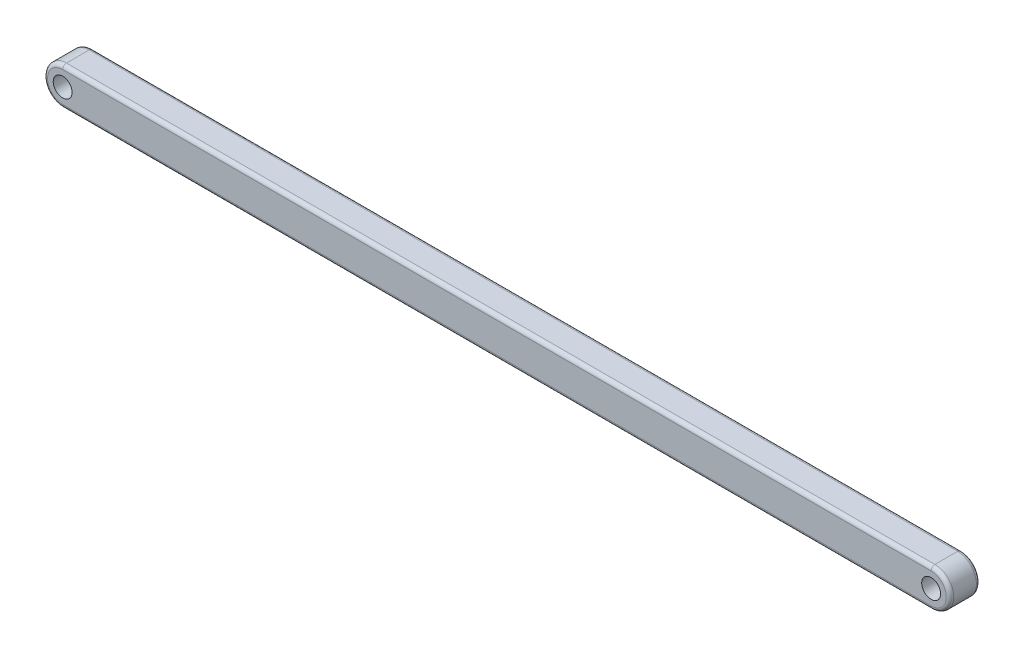
ISO-10303-21;
HEADER;
FILE_DESCRIPTION(('STEP AP214'),'2;1');
FILE_NAME('part.step','',(''),(''),'','','');
FILE_SCHEMA(('AUTOMOTIVE_DESIGN { 1 0 10303 214 1 1 1 1 }'));
ENDSEC;
DATA;
#1=APPLICATION_CONTEXT('core data for automotive mechanical design processes');
#2=APPLICATION_PROTOCOL_DEFINITION('international standard','automotive_design',2000,#1);
#3=PRODUCT_CONTEXT('',#1,'mechanical');
#4=PRODUCT('Part','Part','',(#3));
#5=PRODUCT_RELATED_PRODUCT_CATEGORY('part','',(#4));
#6=PRODUCT_DEFINITION_FORMATION('','',#4);
#7=PRODUCT_DEFINITION_CONTEXT('part definition',#1,'design');
#8=PRODUCT_DEFINITION('design','',#6,#7);
#9=PRODUCT_DEFINITION_SHAPE('','',#8);
#10=(LENGTH_UNIT() NAMED_UNIT(*) SI_UNIT(.MILLI.,.METRE.));
#11=(NAMED_UNIT(*) PLANE_ANGLE_UNIT() SI_UNIT($,.RADIAN.));
#12=(NAMED_UNIT(*) SI_UNIT($,.STERADIAN.) SOLID_ANGLE_UNIT());
#13=UNCERTAINTY_MEASURE_WITH_UNIT(LENGTH_MEASURE(1.E-05),#10,'distance_accuracy_value','');
#14=(GEOMETRIC_REPRESENTATION_CONTEXT(3) GLOBAL_UNCERTAINTY_ASSIGNED_CONTEXT((#13)) GLOBAL_UNIT_ASSIGNED_CONTEXT((#10,
#11,#12)) REPRESENTATION_CONTEXT('',''));
#15=CARTESIAN_POINT('',(0.,0.,0.));
#16=DIRECTION('',(0.,0.,1.));
#17=DIRECTION('',(1.,0.,0.));
#18=AXIS2_PLACEMENT_3D('',#15,#16,#17);
#19=CARTESIAN_POINT('',(-103.706896551724,0.,6.));
#20=DIRECTION('',(0.,0.,1.));
#21=DIRECTION('',(1.,0.,0.));
#22=AXIS2_PLACEMENT_3D('',#19,#20,#21);
#23=PLANE('',#22);
#24=DIRECTION('',(1.,0.,0.));
#25=VECTOR('',#24,1.);
#26=CARTESIAN_POINT('',(126.293103448276,-4.,6.));
#27=LINE('',#26,#25);
#28=CARTESIAN_POINT('',(-103.706896551724,-4.,6.));
#29=VERTEX_POINT('',#28);
#30=CARTESIAN_POINT('',(126.293103448276,-4.,6.));
#31=VERTEX_POINT('',#30);
#32=EDGE_CURVE('E54',#29,#31,#27,.T.);
#33=ORIENTED_EDGE('',*,*,#32,.T.);
#34=CARTESIAN_POINT('',(126.293103448276,0.,6.));
#35=DIRECTION('',(0.,0.,1.));
#36=DIRECTION('',(1.,0.,0.));
#37=AXIS2_PLACEMENT_3D('',#34,#35,#36);
#38=CIRCLE('',#37,4.);
#39=CARTESIAN_POINT('',(126.293103448276,4.,6.));
#40=VERTEX_POINT('',#39);
#41=EDGE_CURVE('E113',#31,#40,#38,.T.);
#42=ORIENTED_EDGE('',*,*,#41,.T.);
#43=DIRECTION('',(-1.,0.,0.));
#44=VECTOR('',#43,1.);
#45=CARTESIAN_POINT('',(-103.706896551724,4.,6.));
#46=LINE('',#45,#44);
#47=CARTESIAN_POINT('',(-103.706896551724,4.,6.));
#48=VERTEX_POINT('',#47);
#49=EDGE_CURVE('E137',#40,#48,#46,.T.);
#50=ORIENTED_EDGE('',*,*,#49,.T.);
#51=CARTESIAN_POINT('',(-103.706896551724,0.,6.));
#52=DIRECTION('',(0.,0.,1.));
#53=DIRECTION('',(1.,0.,0.));
#54=AXIS2_PLACEMENT_3D('',#51,#52,#53);
#55=CIRCLE('',#54,4.);
#56=EDGE_CURVE('E59',#48,#29,#55,.T.);
#57=ORIENTED_EDGE('',*,*,#56,.T.);
#58=EDGE_LOOP('',(#33,#42,#50,#57));
#59=FACE_BOUND('',#58,.T.);
#60=CARTESIAN_POINT('',(-103.706896551724,0.,6.));
#61=DIRECTION('',(0.,0.,1.));
#62=DIRECTION('',(1.,0.,0.));
#63=AXIS2_PLACEMENT_3D('',#60,#61,#62);
#64=CIRCLE('',#63,2.50000000000001);
#65=CARTESIAN_POINT('',(-101.206896551724,0.,6.));
#66=VERTEX_POINT('',#65);
#67=EDGE_CURVE('E174',#66,#66,#64,.T.);
#68=ORIENTED_EDGE('',*,*,#67,.F.);
#69=EDGE_LOOP('',(#68));
#70=FACE_BOUND('',#69,.T.);
#71=CARTESIAN_POINT('',(126.293103448276,0.,6.));
#72=DIRECTION('',(0.,0.,1.));
#73=DIRECTION('',(1.,0.,0.));
#74=AXIS2_PLACEMENT_3D('',#71,#72,#73);
#75=CIRCLE('',#74,2.5);
#76=CARTESIAN_POINT('',(128.793103448276,0.,6.));
#77=VERTEX_POINT('',#76);
#78=EDGE_CURVE('E166',#77,#77,#75,.T.);
#79=ORIENTED_EDGE('',*,*,#78,.F.);
#80=EDGE_LOOP('',(#79));
#81=FACE_BOUND('',#80,.T.);
#82=ADVANCED_FACE('F37',(#59,#70,#81),#23,.T.);
#83=CARTESIAN_POINT('',(-103.706896551724,0.,-2.));
#84=DIRECTION('',(0.,0.,1.));
#85=DIRECTION('',(1.,0.,0.));
#86=AXIS2_PLACEMENT_3D('',#83,#84,#85);
#87=PLANE('',#86);
#88=DIRECTION('',(-1.,0.,0.));
#89=VECTOR('',#88,1.);
#90=CARTESIAN_POINT('',(-103.706896551724,4.,-2.));
#91=LINE('',#90,#89);
#92=CARTESIAN_POINT('',(-103.706896551724,4.,-2.));
#93=VERTEX_POINT('',#92);
#94=CARTESIAN_POINT('',(126.293103448276,4.,-2.));
#95=VERTEX_POINT('',#94);
#96=EDGE_CURVE('E184',#93,#95,#91,.F.);
#97=ORIENTED_EDGE('',*,*,#96,.T.);
#98=CARTESIAN_POINT('',(126.293103448276,0.,-2.));
#99=DIRECTION('',(0.,0.,1.));
#100=DIRECTION('',(1.,0.,0.));
#101=AXIS2_PLACEMENT_3D('',#98,#99,#100);
#102=CIRCLE('',#101,4.);
#103=CARTESIAN_POINT('',(126.293103448276,-4.,-2.));
#104=VERTEX_POINT('',#103);
#105=EDGE_CURVE('E190',#95,#104,#102,.F.);
#106=ORIENTED_EDGE('',*,*,#105,.T.);
#107=DIRECTION('',(1.,0.,0.));
#108=VECTOR('',#107,1.);
#109=CARTESIAN_POINT('',(-103.706896551724,-4.,-2.));
#110=LINE('',#109,#108);
#111=CARTESIAN_POINT('',(-103.706896551724,-4.,-2.));
#112=VERTEX_POINT('',#111);
#113=EDGE_CURVE('E188',#104,#112,#110,.F.);
#114=ORIENTED_EDGE('',*,*,#113,.T.);
#115=CARTESIAN_POINT('',(-103.706896551724,0.,-2.));
#116=DIRECTION('',(0.,0.,1.));
#117=DIRECTION('',(1.,0.,0.));
#118=AXIS2_PLACEMENT_3D('',#115,#116,#117);
#119=CIRCLE('',#118,4.);
#120=EDGE_CURVE('E186',#112,#93,#119,.F.);
#121=ORIENTED_EDGE('',*,*,#120,.T.);
#122=EDGE_LOOP('',(#97,#106,#114,#121));
#123=FACE_BOUND('',#122,.T.);
#124=CARTESIAN_POINT('',(-103.706896551724,0.,-2.));
#125=DIRECTION('',(0.,0.,1.));
#126=DIRECTION('',(1.,0.,0.));
#127=AXIS2_PLACEMENT_3D('',#124,#125,#126);
#128=CIRCLE('',#127,2.50000000000001);
#129=CARTESIAN_POINT('',(-101.206896551724,0.,-2.));
#130=VERTEX_POINT('',#129);
#131=EDGE_CURVE('E171',#130,#130,#128,.T.);
#132=ORIENTED_EDGE('',*,*,#131,.T.);
#133=EDGE_LOOP('',(#132));
#134=FACE_BOUND('',#133,.T.);
#135=CARTESIAN_POINT('',(126.293103448276,0.,-2.));
#136=DIRECTION('',(0.,0.,1.));
#137=DIRECTION('',(1.,0.,0.));
#138=AXIS2_PLACEMENT_3D('',#135,#136,#137);
#139=CIRCLE('',#138,2.5);
#140=CARTESIAN_POINT('',(128.793103448276,0.,-2.));
#141=VERTEX_POINT('',#140);
#142=EDGE_CURVE('E160',#141,#141,#139,.T.);
#143=ORIENTED_EDGE('',*,*,#142,.T.);
#144=EDGE_LOOP('',(#143));
#145=FACE_BOUND('',#144,.T.);
#146=ADVANCED_FACE('F230',(#123,#134,#145),#87,.F.);
#147=CARTESIAN_POINT('',(-103.706896551724,0.,6.));
#148=DIRECTION('',(0.,0.,-1.));
#149=DIRECTION('',(-1.,0.,0.));
#150=AXIS2_PLACEMENT_3D('',#147,#148,#149);
#151=CYLINDRICAL_SURFACE('',#150,5.);
#152=DIRECTION('',(0.,0.,-1.));
#153=VECTOR('',#152,1.);
#154=CARTESIAN_POINT('',(-103.706896551724,5.,6.));
#155=LINE('',#154,#153);
#156=CARTESIAN_POINT('',(-103.706896551724,5.,5.));
#157=VERTEX_POINT('',#156);
#158=CARTESIAN_POINT('',(-103.706896551724,5.,-1.));
#159=VERTEX_POINT('',#158);
#160=EDGE_CURVE('E108',#157,#159,#155,.T.);
#161=ORIENTED_EDGE('',*,*,#160,.T.);
#162=CARTESIAN_POINT('',(-103.706896551724,0.,-1.));
#163=DIRECTION('',(0.,0.,1.));
#164=DIRECTION('',(1.,0.,0.));
#165=AXIS2_PLACEMENT_3D('',#162,#163,#164);
#166=CIRCLE('',#165,5.);
#167=CARTESIAN_POINT('',(-103.706896551724,-5.,-1.));
#168=VERTEX_POINT('',#167);
#169=EDGE_CURVE('E199',#159,#168,#166,.T.);
#170=ORIENTED_EDGE('',*,*,#169,.T.);
#171=DIRECTION('',(0.,0.,-1.));
#172=VECTOR('',#171,1.);
#173=CARTESIAN_POINT('',(-103.706896551724,-5.,6.));
#174=LINE('',#173,#172);
#175=CARTESIAN_POINT('',(-103.706896551724,-5.,5.));
#176=VERTEX_POINT('',#175);
#177=EDGE_CURVE('E134',#176,#168,#174,.T.);
#178=ORIENTED_EDGE('',*,*,#177,.F.);
#179=CARTESIAN_POINT('',(-103.706896551724,0.,5.));
#180=DIRECTION('',(0.,0.,1.));
#181=DIRECTION('',(1.,0.,0.));
#182=AXIS2_PLACEMENT_3D('',#179,#180,#181);
#183=CIRCLE('',#182,5.);
#184=EDGE_CURVE('E197',#176,#157,#183,.F.);
#185=ORIENTED_EDGE('',*,*,#184,.T.);
#186=EDGE_LOOP('',(#161,#170,#178,#185));
#187=FACE_BOUND('',#186,.T.);
#188=ADVANCED_FACE('F212',(#187),#151,.T.);
#189=CARTESIAN_POINT('',(-103.706896551724,-5.,6.));
#190=DIRECTION('',(0.,1.,0.));
#191=DIRECTION('',(0.,0.,1.));
#192=AXIS2_PLACEMENT_3D('',#189,#190,#191);
#193=PLANE('',#192);
#194=ORIENTED_EDGE('',*,*,#177,.T.);
#195=DIRECTION('',(1.,0.,0.));
#196=VECTOR('',#195,1.);
#197=CARTESIAN_POINT('',(-103.706896551724,-5.,-1.));
#198=LINE('',#197,#196);
#199=CARTESIAN_POINT('',(126.293103448276,-5.,-1.));
#200=VERTEX_POINT('',#199);
#201=EDGE_CURVE('E195',#168,#200,#198,.T.);
#202=ORIENTED_EDGE('',*,*,#201,.T.);
#203=DIRECTION('',(0.,0.,-1.));
#204=VECTOR('',#203,1.);
#205=CARTESIAN_POINT('',(126.293103448276,-5.,6.));
#206=LINE('',#205,#204);
#207=CARTESIAN_POINT('',(126.293103448276,-5.,5.));
#208=VERTEX_POINT('',#207);
#209=EDGE_CURVE('E125',#208,#200,#206,.T.);
#210=ORIENTED_EDGE('',*,*,#209,.F.);
#211=DIRECTION('',(1.,0.,0.));
#212=VECTOR('',#211,1.);
#213=CARTESIAN_POINT('',(-103.706896551724,-5.,5.));
#214=LINE('',#213,#212);
#215=EDGE_CURVE('E193',#208,#176,#214,.F.);
#216=ORIENTED_EDGE('',*,*,#215,.T.);
#217=EDGE_LOOP('',(#194,#202,#210,#216));
#218=FACE_BOUND('',#217,.T.);
#219=ADVANCED_FACE('F210',(#218),#193,.F.);
#220=CARTESIAN_POINT('',(126.293103448276,0.,6.));
#221=DIRECTION('',(0.,0.,-1.));
#222=DIRECTION('',(-1.,0.,0.));
#223=AXIS2_PLACEMENT_3D('',#220,#221,#222);
#224=CYLINDRICAL_SURFACE('',#223,5.);
#225=ORIENTED_EDGE('',*,*,#209,.T.);
#226=CARTESIAN_POINT('',(126.293103448276,0.,-1.));
#227=DIRECTION('',(0.,0.,1.));
#228=DIRECTION('',(1.,0.,0.));
#229=AXIS2_PLACEMENT_3D('',#226,#227,#228);
#230=CIRCLE('',#229,5.);
#231=CARTESIAN_POINT('',(126.293103448276,5.,-1.));
#232=VERTEX_POINT('',#231);
#233=EDGE_CURVE('E124',#200,#232,#230,.T.);
#234=ORIENTED_EDGE('',*,*,#233,.T.);
#235=DIRECTION('',(0.,0.,-1.));
#236=VECTOR('',#235,1.);
#237=CARTESIAN_POINT('',(126.293103448276,5.,6.));
#238=LINE('',#237,#236);
#239=CARTESIAN_POINT('',(126.293103448276,5.,5.));
#240=VERTEX_POINT('',#239);
#241=EDGE_CURVE('E106',#240,#232,#238,.T.);
#242=ORIENTED_EDGE('',*,*,#241,.F.);
#243=CARTESIAN_POINT('',(126.293103448276,0.,5.));
#244=DIRECTION('',(0.,0.,1.));
#245=DIRECTION('',(1.,0.,0.));
#246=AXIS2_PLACEMENT_3D('',#243,#244,#245);
#247=CIRCLE('',#246,5.);
#248=EDGE_CURVE('E121',#240,#208,#247,.F.);
#249=ORIENTED_EDGE('',*,*,#248,.T.);
#250=EDGE_LOOP('',(#225,#234,#242,#249));
#251=FACE_BOUND('',#250,.T.);
#252=ADVANCED_FACE('F120',(#251),#224,.T.);
#253=CARTESIAN_POINT('',(-103.706896551724,5.,6.));
#254=DIRECTION('',(0.,-1.,0.));
#255=DIRECTION('',(0.,0.,-1.));
#256=AXIS2_PLACEMENT_3D('',#253,#254,#255);
#257=PLANE('',#256);
#258=ORIENTED_EDGE('',*,*,#241,.T.);
#259=DIRECTION('',(-1.,0.,0.));
#260=VECTOR('',#259,1.);
#261=CARTESIAN_POINT('',(-103.706896551724,5.,-1.));
#262=LINE('',#261,#260);
#263=EDGE_CURVE('E11',#232,#159,#262,.T.);
#264=ORIENTED_EDGE('',*,*,#263,.T.);
#265=ORIENTED_EDGE('',*,*,#160,.F.);
#266=DIRECTION('',(-1.,0.,0.));
#267=VECTOR('',#266,1.);
#268=CARTESIAN_POINT('',(126.293103448276,5.,5.));
#269=LINE('',#268,#267);
#270=EDGE_CURVE('E46',#157,#240,#269,.F.);
#271=ORIENTED_EDGE('',*,*,#270,.T.);
#272=EDGE_LOOP('',(#258,#264,#265,#271));
#273=FACE_BOUND('',#272,.T.);
#274=ADVANCED_FACE('F105',(#273),#257,.F.);
#275=CARTESIAN_POINT('',(-103.706896551724,0.,6.));
#276=DIRECTION('',(0.,0.,-1.));
#277=DIRECTION('',(-1.,0.,0.));
#278=AXIS2_PLACEMENT_3D('',#275,#276,#277);
#279=CYLINDRICAL_SURFACE('',#278,2.50000000000001);
#280=ORIENTED_EDGE('',*,*,#67,.T.);
#281=EDGE_LOOP('',(#280));
#282=FACE_BOUND('',#281,.T.);
#283=ORIENTED_EDGE('',*,*,#131,.F.);
#284=EDGE_LOOP('',(#283));
#285=FACE_BOUND('',#284,.T.);
#286=ADVANCED_FACE('F238',(#282,#285),#279,.F.);
#287=CARTESIAN_POINT('',(126.293103448276,0.,6.));
#288=DIRECTION('',(0.,0.,-1.));
#289=DIRECTION('',(-1.,0.,0.));
#290=AXIS2_PLACEMENT_3D('',#287,#288,#289);
#291=CYLINDRICAL_SURFACE('',#290,2.5);
#292=ORIENTED_EDGE('',*,*,#78,.T.);
#293=EDGE_LOOP('',(#292));
#294=FACE_BOUND('',#293,.T.);
#295=ORIENTED_EDGE('',*,*,#142,.F.);
#296=EDGE_LOOP('',(#295));
#297=FACE_BOUND('',#296,.T.);
#298=ADVANCED_FACE('F269',(#294,#297),#291,.F.);
#299=CARTESIAN_POINT('',(-103.706896551724,0.,-1.));
#300=DIRECTION('',(0.,0.,1.));
#301=DIRECTION('',(1.,0.,0.));
#302=AXIS2_PLACEMENT_3D('',#299,#300,#301);
#303=TOROIDAL_SURFACE('',#302,4.,1.);
#304=CARTESIAN_POINT('',(-103.706896551724,4.,-1.));
#305=DIRECTION('',(1.,0.,0.));
#306=DIRECTION('',(0.,0.,-1.));
#307=AXIS2_PLACEMENT_3D('',#304,#305,#306);
#308=CIRCLE('',#307,1.);
#309=EDGE_CURVE('E153',#93,#159,#308,.T.);
#310=ORIENTED_EDGE('',*,*,#309,.F.);
#311=ORIENTED_EDGE('',*,*,#120,.F.);
#312=CARTESIAN_POINT('',(-103.706896551724,-4.,-1.));
#313=DIRECTION('',(1.,0.,0.));
#314=DIRECTION('',(0.,0.,-1.));
#315=AXIS2_PLACEMENT_3D('',#312,#313,#314);
#316=CIRCLE('',#315,1.);
#317=EDGE_CURVE('E142',#168,#112,#316,.T.);
#318=ORIENTED_EDGE('',*,*,#317,.F.);
#319=ORIENTED_EDGE('',*,*,#169,.F.);
#320=EDGE_LOOP('',(#310,#311,#318,#319));
#321=FACE_BOUND('',#320,.T.);
#322=ADVANCED_FACE('F215',(#321),#303,.T.);
#323=CARTESIAN_POINT('',(-103.706896551724,-4.,-1.));
#324=DIRECTION('',(1.,0.,0.));
#325=DIRECTION('',(0.,0.,-1.));
#326=AXIS2_PLACEMENT_3D('',#323,#324,#325);
#327=CYLINDRICAL_SURFACE('',#326,1.);
#328=ORIENTED_EDGE('',*,*,#317,.T.);
#329=ORIENTED_EDGE('',*,*,#113,.F.);
#330=CARTESIAN_POINT('',(126.293103448276,-4.,-1.));
#331=DIRECTION('',(1.,0.,0.));
#332=DIRECTION('',(0.,0.,-1.));
#333=AXIS2_PLACEMENT_3D('',#330,#331,#332);
#334=CIRCLE('',#333,1.);
#335=EDGE_CURVE('E147',#200,#104,#334,.T.);
#336=ORIENTED_EDGE('',*,*,#335,.F.);
#337=ORIENTED_EDGE('',*,*,#201,.F.);
#338=EDGE_LOOP('',(#328,#329,#336,#337));
#339=FACE_BOUND('',#338,.T.);
#340=ADVANCED_FACE('F218',(#339),#327,.T.);
#341=CARTESIAN_POINT('',(-103.706896551724,4.,-1.));
#342=DIRECTION('',(-1.,0.,0.));
#343=DIRECTION('',(0.,0.,1.));
#344=AXIS2_PLACEMENT_3D('',#341,#342,#343);
#345=CYLINDRICAL_SURFACE('',#344,1.);
#346=ORIENTED_EDGE('',*,*,#309,.T.);
#347=ORIENTED_EDGE('',*,*,#263,.F.);
#348=CARTESIAN_POINT('',(126.293103448276,4.,-1.));
#349=DIRECTION('',(1.,0.,0.));
#350=DIRECTION('',(0.,0.,-1.));
#351=AXIS2_PLACEMENT_3D('',#348,#349,#350);
#352=CIRCLE('',#351,1.);
#353=EDGE_CURVE('E145',#95,#232,#352,.T.);
#354=ORIENTED_EDGE('',*,*,#353,.F.);
#355=ORIENTED_EDGE('',*,*,#96,.F.);
#356=EDGE_LOOP('',(#346,#347,#354,#355));
#357=FACE_BOUND('',#356,.T.);
#358=ADVANCED_FACE('F221',(#357),#345,.T.);
#359=CARTESIAN_POINT('',(126.293103448276,0.,-1.));
#360=DIRECTION('',(0.,0.,1.));
#361=DIRECTION('',(1.,0.,0.));
#362=AXIS2_PLACEMENT_3D('',#359,#360,#361);
#363=TOROIDAL_SURFACE('',#362,4.,1.);
#364=ORIENTED_EDGE('',*,*,#335,.T.);
#365=ORIENTED_EDGE('',*,*,#105,.F.);
#366=ORIENTED_EDGE('',*,*,#353,.T.);
#367=ORIENTED_EDGE('',*,*,#233,.F.);
#368=EDGE_LOOP('',(#364,#365,#366,#367));
#369=FACE_BOUND('',#368,.T.);
#370=ADVANCED_FACE('F219',(#369),#363,.T.);
#371=CARTESIAN_POINT('',(-103.706896551724,0.,5.));
#372=DIRECTION('',(0.,0.,1.));
#373=DIRECTION('',(1.,0.,0.));
#374=AXIS2_PLACEMENT_3D('',#371,#372,#373);
#375=TOROIDAL_SURFACE('',#374,4.,1.);
#376=CARTESIAN_POINT('',(-103.706896551724,4.,5.));
#377=DIRECTION('',(1.,0.,0.));
#378=DIRECTION('',(0.,0.,-1.));
#379=AXIS2_PLACEMENT_3D('',#376,#377,#378);
#380=CIRCLE('',#379,1.);
#381=EDGE_CURVE('E139',#157,#48,#380,.T.);
#382=ORIENTED_EDGE('',*,*,#381,.F.);
#383=ORIENTED_EDGE('',*,*,#184,.F.);
#384=CARTESIAN_POINT('',(-103.706896551724,-4.,5.));
#385=DIRECTION('',(1.,0.,0.));
#386=DIRECTION('',(0.,0.,-1.));
#387=AXIS2_PLACEMENT_3D('',#384,#385,#386);
#388=CIRCLE('',#387,1.);
#389=EDGE_CURVE('E41',#29,#176,#388,.T.);
#390=ORIENTED_EDGE('',*,*,#389,.F.);
#391=ORIENTED_EDGE('',*,*,#56,.F.);
#392=EDGE_LOOP('',(#382,#383,#390,#391));
#393=FACE_BOUND('',#392,.T.);
#394=ADVANCED_FACE('F39',(#393),#375,.T.);
#395=CARTESIAN_POINT('',(-103.706896551724,-4.,5.));
#396=DIRECTION('',(-1.,0.,0.));
#397=DIRECTION('',(0.,0.,1.));
#398=AXIS2_PLACEMENT_3D('',#395,#396,#397);
#399=CYLINDRICAL_SURFACE('',#398,1.);
#400=ORIENTED_EDGE('',*,*,#389,.T.);
#401=ORIENTED_EDGE('',*,*,#215,.F.);
#402=CARTESIAN_POINT('',(126.293103448276,-4.,5.));
#403=DIRECTION('',(1.,0.,0.));
#404=DIRECTION('',(0.,0.,-1.));
#405=AXIS2_PLACEMENT_3D('',#402,#403,#404);
#406=CIRCLE('',#405,1.);
#407=EDGE_CURVE('E132',#31,#208,#406,.T.);
#408=ORIENTED_EDGE('',*,*,#407,.F.);
#409=ORIENTED_EDGE('',*,*,#32,.F.);
#410=EDGE_LOOP('',(#400,#401,#408,#409));
#411=FACE_BOUND('',#410,.T.);
#412=ADVANCED_FACE('F207',(#411),#399,.T.);
#413=CARTESIAN_POINT('',(-103.706896551724,4.,5.));
#414=DIRECTION('',(1.,0.,0.));
#415=DIRECTION('',(0.,0.,-1.));
#416=AXIS2_PLACEMENT_3D('',#413,#414,#415);
#417=CYLINDRICAL_SURFACE('',#416,1.);
#418=ORIENTED_EDGE('',*,*,#381,.T.);
#419=ORIENTED_EDGE('',*,*,#49,.F.);
#420=CARTESIAN_POINT('',(126.293103448276,4.,5.));
#421=DIRECTION('',(1.,0.,0.));
#422=DIRECTION('',(0.,0.,-1.));
#423=AXIS2_PLACEMENT_3D('',#420,#421,#422);
#424=CIRCLE('',#423,1.);
#425=EDGE_CURVE('E130',#240,#40,#424,.T.);
#426=ORIENTED_EDGE('',*,*,#425,.F.);
#427=ORIENTED_EDGE('',*,*,#270,.F.);
#428=EDGE_LOOP('',(#418,#419,#426,#427));
#429=FACE_BOUND('',#428,.T.);
#430=ADVANCED_FACE('F136',(#429),#417,.T.);
#431=CARTESIAN_POINT('',(126.293103448276,0.,5.));
#432=DIRECTION('',(0.,0.,1.));
#433=DIRECTION('',(1.,0.,0.));
#434=AXIS2_PLACEMENT_3D('',#431,#432,#433);
#435=TOROIDAL_SURFACE('',#434,4.,1.);
#436=ORIENTED_EDGE('',*,*,#407,.T.);
#437=ORIENTED_EDGE('',*,*,#248,.F.);
#438=ORIENTED_EDGE('',*,*,#425,.T.);
#439=ORIENTED_EDGE('',*,*,#41,.F.);
#440=EDGE_LOOP('',(#436,#437,#438,#439));
#441=FACE_BOUND('',#440,.T.);
#442=ADVANCED_FACE('F128',(#441),#435,.T.);
#443=CLOSED_SHELL('',(#82,#146,#188,#219,#252,#274,#286,#298,#322,#340,#358,#370,#394,#412,#430,#442));
#444=MANIFOLD_SOLID_BREP('B2',#443);
#445=ADVANCED_BREP_SHAPE_REPRESENTATION('',(#18,#444),#14);
#446=SHAPE_DEFINITION_REPRESENTATION(#9,#445);
ENDSEC;
END-ISO-10303-21;
